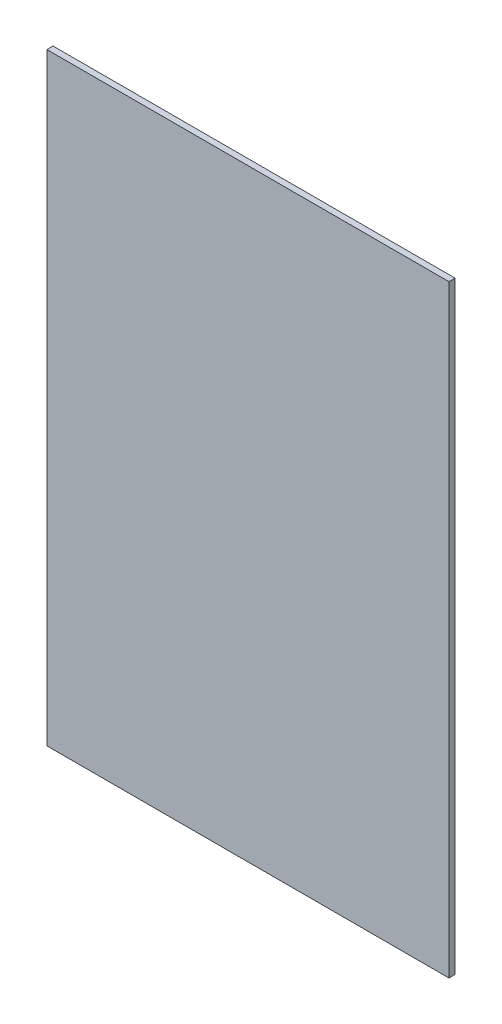
ISO-10303-21;
HEADER;
FILE_DESCRIPTION(('STEP AP214'),'2;1');
FILE_NAME('part.step','',(''),(''),'','','');
FILE_SCHEMA(('AUTOMOTIVE_DESIGN { 1 0 10303 214 1 1 1 1 }'));
ENDSEC;
DATA;
#1=APPLICATION_CONTEXT('core data for automotive mechanical design processes');
#2=APPLICATION_PROTOCOL_DEFINITION('international standard','automotive_design',2000,#1);
#3=PRODUCT_CONTEXT('',#1,'mechanical');
#4=PRODUCT('Part','Part','',(#3));
#5=PRODUCT_RELATED_PRODUCT_CATEGORY('part','',(#4));
#6=PRODUCT_DEFINITION_FORMATION('','',#4);
#7=PRODUCT_DEFINITION_CONTEXT('part definition',#1,'design');
#8=PRODUCT_DEFINITION('design','',#6,#7);
#9=PRODUCT_DEFINITION_SHAPE('','',#8);
#10=(LENGTH_UNIT() NAMED_UNIT(*) SI_UNIT(.MILLI.,.METRE.));
#11=(NAMED_UNIT(*) PLANE_ANGLE_UNIT() SI_UNIT($,.RADIAN.));
#12=(NAMED_UNIT(*) SI_UNIT($,.STERADIAN.) SOLID_ANGLE_UNIT());
#13=UNCERTAINTY_MEASURE_WITH_UNIT(LENGTH_MEASURE(1.E-05),#10,'distance_accuracy_value','');
#14=(GEOMETRIC_REPRESENTATION_CONTEXT(3) GLOBAL_UNCERTAINTY_ASSIGNED_CONTEXT((#13)) GLOBAL_UNIT_ASSIGNED_CONTEXT((#10,
#11,#12)) REPRESENTATION_CONTEXT('',''));
#15=CARTESIAN_POINT('',(0.,0.,0.));
#16=DIRECTION('',(0.,0.,1.));
#17=DIRECTION('',(1.,0.,0.));
#18=AXIS2_PLACEMENT_3D('',#15,#16,#17);
#19=CARTESIAN_POINT('',(50.,-75.,1.524));
#20=DIRECTION('',(-1.,0.,0.));
#21=DIRECTION('',(0.,0.,1.));
#22=AXIS2_PLACEMENT_3D('',#19,#20,#21);
#23=PLANE('',#22);
#24=DIRECTION('',(0.,1.,0.));
#25=VECTOR('',#24,1.);
#26=CARTESIAN_POINT('',(50.,-75.,0.));
#27=LINE('',#26,#25);
#28=CARTESIAN_POINT('',(50.,-75.,0.));
#29=VERTEX_POINT('',#28);
#30=CARTESIAN_POINT('',(50.,75.,0.));
#31=VERTEX_POINT('',#30);
#32=EDGE_CURVE('E101',#29,#31,#27,.T.);
#33=ORIENTED_EDGE('',*,*,#32,.T.);
#34=DIRECTION('',(0.,0.,-1.));
#35=VECTOR('',#34,1.);
#36=CARTESIAN_POINT('',(50.,75.,1.524));
#37=LINE('',#36,#35);
#38=CARTESIAN_POINT('',(50.,75.,1.524));
#39=VERTEX_POINT('',#38);
#40=EDGE_CURVE('E11',#39,#31,#37,.T.);
#41=ORIENTED_EDGE('',*,*,#40,.F.);
#42=DIRECTION('',(0.,1.,0.));
#43=VECTOR('',#42,1.);
#44=CARTESIAN_POINT('',(50.,-75.,1.524));
#45=LINE('',#44,#43);
#46=CARTESIAN_POINT('',(50.,-75.,1.524));
#47=VERTEX_POINT('',#46);
#48=EDGE_CURVE('E89',#47,#39,#45,.T.);
#49=ORIENTED_EDGE('',*,*,#48,.F.);
#50=DIRECTION('',(0.,0.,-1.));
#51=VECTOR('',#50,1.);
#52=CARTESIAN_POINT('',(50.,-75.,1.524));
#53=LINE('',#52,#51);
#54=EDGE_CURVE('E97',#47,#29,#53,.T.);
#55=ORIENTED_EDGE('',*,*,#54,.T.);
#56=EDGE_LOOP('',(#33,#41,#49,#55));
#57=FACE_BOUND('',#56,.T.);
#58=ADVANCED_FACE('F38',(#57),#23,.F.);
#59=CARTESIAN_POINT('',(-50.,75.,1.524));
#60=DIRECTION('',(0.,-1.,0.));
#61=DIRECTION('',(0.,0.,-1.));
#62=AXIS2_PLACEMENT_3D('',#59,#60,#61);
#63=PLANE('',#62);
#64=DIRECTION('',(-1.,0.,0.));
#65=VECTOR('',#64,1.);
#66=CARTESIAN_POINT('',(-50.,75.,0.));
#67=LINE('',#66,#65);
#68=CARTESIAN_POINT('',(-50.,75.,0.));
#69=VERTEX_POINT('',#68);
#70=EDGE_CURVE('E93',#31,#69,#67,.T.);
#71=ORIENTED_EDGE('',*,*,#70,.T.);
#72=DIRECTION('',(0.,0.,-1.));
#73=VECTOR('',#72,1.);
#74=CARTESIAN_POINT('',(-50.,75.,1.524));
#75=LINE('',#74,#73);
#76=CARTESIAN_POINT('',(-50.,75.,1.524));
#77=VERTEX_POINT('',#76);
#78=EDGE_CURVE('E46',#77,#69,#75,.T.);
#79=ORIENTED_EDGE('',*,*,#78,.F.);
#80=DIRECTION('',(-1.,0.,0.));
#81=VECTOR('',#80,1.);
#82=CARTESIAN_POINT('',(-50.,75.,1.524));
#83=LINE('',#82,#81);
#84=EDGE_CURVE('E84',#39,#77,#83,.T.);
#85=ORIENTED_EDGE('',*,*,#84,.F.);
#86=ORIENTED_EDGE('',*,*,#40,.T.);
#87=EDGE_LOOP('',(#71,#79,#85,#86));
#88=FACE_BOUND('',#87,.T.);
#89=ADVANCED_FACE('F92',(#88),#63,.F.);
#90=CARTESIAN_POINT('',(-50.,-75.,1.524));
#91=DIRECTION('',(1.,0.,0.));
#92=DIRECTION('',(0.,0.,-1.));
#93=AXIS2_PLACEMENT_3D('',#90,#91,#92);
#94=PLANE('',#93);
#95=DIRECTION('',(0.,-1.,0.));
#96=VECTOR('',#95,1.);
#97=CARTESIAN_POINT('',(-50.,-75.,0.));
#98=LINE('',#97,#96);
#99=CARTESIAN_POINT('',(-50.,-75.,0.));
#100=VERTEX_POINT('',#99);
#101=EDGE_CURVE('E71',#69,#100,#98,.T.);
#102=ORIENTED_EDGE('',*,*,#101,.T.);
#103=DIRECTION('',(0.,0.,-1.));
#104=VECTOR('',#103,1.);
#105=CARTESIAN_POINT('',(-50.,-75.,1.524));
#106=LINE('',#105,#104);
#107=CARTESIAN_POINT('',(-50.,-75.,1.524));
#108=VERTEX_POINT('',#107);
#109=EDGE_CURVE('E94',#108,#100,#106,.T.);
#110=ORIENTED_EDGE('',*,*,#109,.F.);
#111=DIRECTION('',(0.,-1.,0.));
#112=VECTOR('',#111,1.);
#113=CARTESIAN_POINT('',(-50.,-75.,1.524));
#114=LINE('',#113,#112);
#115=EDGE_CURVE('E87',#77,#108,#114,.T.);
#116=ORIENTED_EDGE('',*,*,#115,.F.);
#117=ORIENTED_EDGE('',*,*,#78,.T.);
#118=EDGE_LOOP('',(#102,#110,#116,#117));
#119=FACE_BOUND('',#118,.T.);
#120=ADVANCED_FACE('F95',(#119),#94,.F.);
#121=CARTESIAN_POINT('',(-50.,-75.,1.524));
#122=DIRECTION('',(0.,1.,0.));
#123=DIRECTION('',(0.,0.,1.));
#124=AXIS2_PLACEMENT_3D('',#121,#122,#123);
#125=PLANE('',#124);
#126=DIRECTION('',(1.,0.,0.));
#127=VECTOR('',#126,1.);
#128=CARTESIAN_POINT('',(-50.,-75.,0.));
#129=LINE('',#128,#127);
#130=EDGE_CURVE('E77',#100,#29,#129,.T.);
#131=ORIENTED_EDGE('',*,*,#130,.T.);
#132=ORIENTED_EDGE('',*,*,#54,.F.);
#133=DIRECTION('',(1.,0.,0.));
#134=VECTOR('',#133,1.);
#135=CARTESIAN_POINT('',(-50.,-75.,1.524));
#136=LINE('',#135,#134);
#137=EDGE_CURVE('E54',#108,#47,#136,.T.);
#138=ORIENTED_EDGE('',*,*,#137,.F.);
#139=ORIENTED_EDGE('',*,*,#109,.T.);
#140=EDGE_LOOP('',(#131,#132,#138,#139));
#141=FACE_BOUND('',#140,.T.);
#142=ADVANCED_FACE('F108',(#141),#125,.F.);
#143=CARTESIAN_POINT('',(50.,75.,1.524));
#144=DIRECTION('',(0.,0.,-1.));
#145=DIRECTION('',(-1.,0.,0.));
#146=AXIS2_PLACEMENT_3D('',#143,#144,#145);
#147=PLANE('',#146);
#148=ORIENTED_EDGE('',*,*,#48,.T.);
#149=ORIENTED_EDGE('',*,*,#84,.T.);
#150=ORIENTED_EDGE('',*,*,#115,.T.);
#151=ORIENTED_EDGE('',*,*,#137,.T.);
#152=EDGE_LOOP('',(#148,#149,#150,#151));
#153=FACE_BOUND('',#152,.T.);
#154=ADVANCED_FACE('F85',(#153),#147,.F.);
#155=CARTESIAN_POINT('',(50.,75.,0.));
#156=DIRECTION('',(0.,0.,-1.));
#157=DIRECTION('',(-1.,0.,0.));
#158=AXIS2_PLACEMENT_3D('',#155,#156,#157);
#159=PLANE('',#158);
#160=ORIENTED_EDGE('',*,*,#32,.F.);
#161=ORIENTED_EDGE('',*,*,#130,.F.);
#162=ORIENTED_EDGE('',*,*,#101,.F.);
#163=ORIENTED_EDGE('',*,*,#70,.F.);
#164=EDGE_LOOP('',(#160,#161,#162,#163));
#165=FACE_BOUND('',#164,.T.);
#166=ADVANCED_FACE('F111',(#165),#159,.T.);
#167=CLOSED_SHELL('',(#58,#89,#120,#142,#154,#166));
#168=MANIFOLD_SOLID_BREP('B2',#167);
#169=ADVANCED_BREP_SHAPE_REPRESENTATION('',(#18,#168),#14);
#170=SHAPE_DEFINITION_REPRESENTATION(#9,#169);
ENDSEC;
END-ISO-10303-21;
